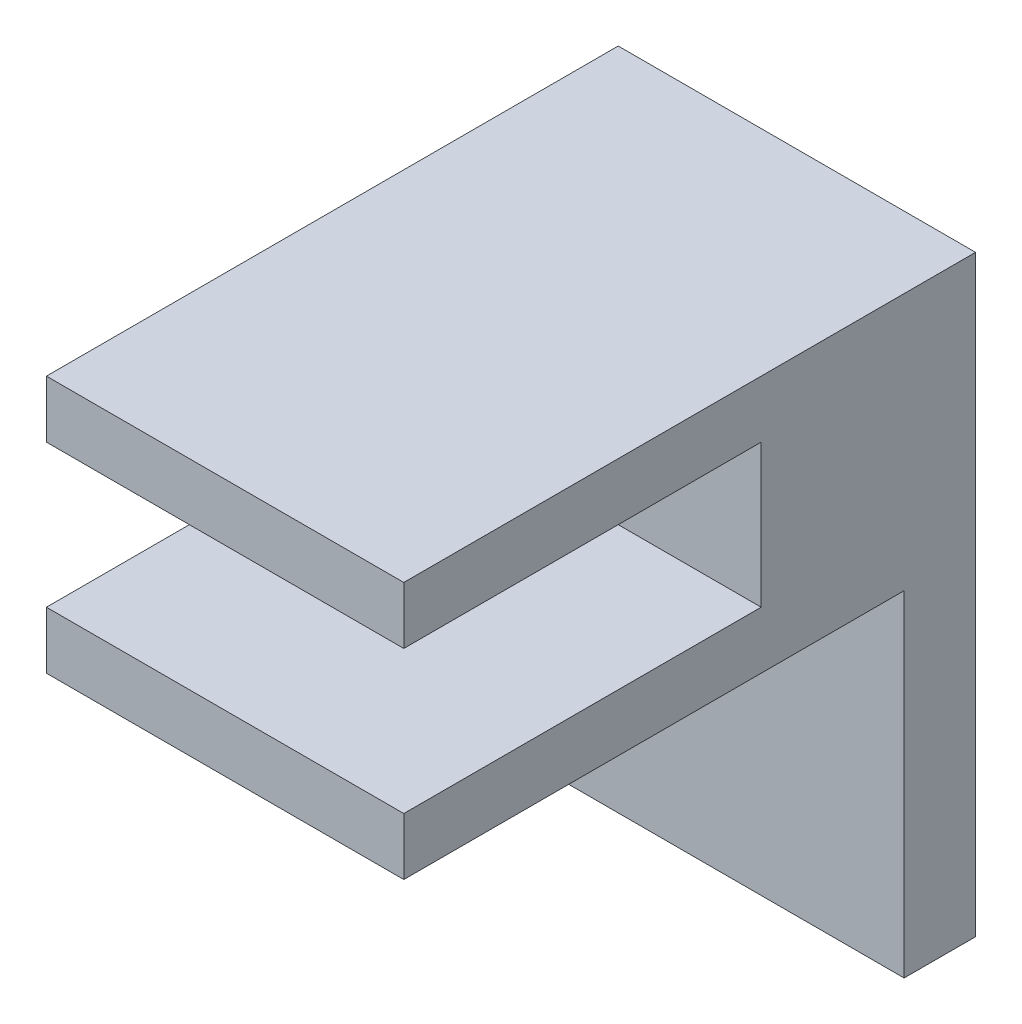
ISO-10303-21;
HEADER;
FILE_DESCRIPTION(('STEP AP214'),'2;1');
FILE_NAME('part.step','',(''),(''),'','','');
FILE_SCHEMA(('AUTOMOTIVE_DESIGN { 1 0 10303 214 1 1 1 1 }'));
ENDSEC;
DATA;
#1=APPLICATION_CONTEXT('core data for automotive mechanical design processes');
#2=APPLICATION_PROTOCOL_DEFINITION('international standard','automotive_design',2000,#1);
#3=PRODUCT_CONTEXT('',#1,'mechanical');
#4=PRODUCT('Part','Part','',(#3));
#5=PRODUCT_RELATED_PRODUCT_CATEGORY('part','',(#4));
#6=PRODUCT_DEFINITION_FORMATION('','',#4);
#7=PRODUCT_DEFINITION_CONTEXT('part definition',#1,'design');
#8=PRODUCT_DEFINITION('design','',#6,#7);
#9=PRODUCT_DEFINITION_SHAPE('','',#8);
#10=(LENGTH_UNIT() NAMED_UNIT(*) SI_UNIT(.MILLI.,.METRE.));
#11=(NAMED_UNIT(*) PLANE_ANGLE_UNIT() SI_UNIT($,.RADIAN.));
#12=(NAMED_UNIT(*) SI_UNIT($,.STERADIAN.) SOLID_ANGLE_UNIT());
#13=UNCERTAINTY_MEASURE_WITH_UNIT(LENGTH_MEASURE(1.E-05),#10,'distance_accuracy_value','');
#14=(GEOMETRIC_REPRESENTATION_CONTEXT(3) GLOBAL_UNCERTAINTY_ASSIGNED_CONTEXT((#13)) GLOBAL_UNIT_ASSIGNED_CONTEXT((#10,
#11,#12)) REPRESENTATION_CONTEXT('',''));
#15=CARTESIAN_POINT('',(0.,0.,0.));
#16=DIRECTION('',(0.,0.,1.));
#17=DIRECTION('',(1.,0.,0.));
#18=AXIS2_PLACEMENT_3D('',#15,#16,#17);
#19=CARTESIAN_POINT('',(12.5,0.,0.));
#20=DIRECTION('',(0.,0.,1.));
#21=DIRECTION('',(1.,0.,0.));
#22=AXIS2_PLACEMENT_3D('',#19,#20,#21);
#23=PLANE('',#22);
#24=DIRECTION('',(0.,1.,0.));
#25=VECTOR('',#24,1.);
#26=CARTESIAN_POINT('',(-12.5,0.,0.));
#27=LINE('',#26,#25);
#28=CARTESIAN_POINT('',(-12.5,-22.6367730720593,0.));
#29=VERTEX_POINT('',#28);
#30=CARTESIAN_POINT('',(-12.5,18.8277402245337,0.));
#31=VERTEX_POINT('',#30);
#32=EDGE_CURVE('E93',#29,#31,#27,.T.);
#33=ORIENTED_EDGE('',*,*,#32,.T.);
#34=DIRECTION('',(-1.,0.,0.));
#35=VECTOR('',#34,1.);
#36=CARTESIAN_POINT('',(12.5,18.8277402245337,0.));
#37=LINE('',#36,#35);
#38=CARTESIAN_POINT('',(12.5,18.8277402245337,0.));
#39=VERTEX_POINT('',#38);
#40=EDGE_CURVE('E11',#39,#31,#37,.T.);
#41=ORIENTED_EDGE('',*,*,#40,.F.);
#42=DIRECTION('',(0.,1.,0.));
#43=VECTOR('',#42,1.);
#44=CARTESIAN_POINT('',(12.5,0.,0.));
#45=LINE('',#44,#43);
#46=CARTESIAN_POINT('',(12.5,-22.6367730720593,0.));
#47=VERTEX_POINT('',#46);
#48=EDGE_CURVE('E99',#47,#39,#45,.T.);
#49=ORIENTED_EDGE('',*,*,#48,.F.);
#50=DIRECTION('',(-1.,0.,0.));
#51=VECTOR('',#50,1.);
#52=CARTESIAN_POINT('',(12.5,-22.6367730720593,0.));
#53=LINE('',#52,#51);
#54=EDGE_CURVE('E139',#47,#29,#53,.T.);
#55=ORIENTED_EDGE('',*,*,#54,.T.);
#56=EDGE_LOOP('',(#33,#41,#49,#55));
#57=FACE_BOUND('',#56,.T.);
#58=ADVANCED_FACE('F35',(#57),#23,.F.);
#59=CARTESIAN_POINT('',(12.5,18.8277402245337,0.));
#60=DIRECTION('',(0.,-1.,0.));
#61=DIRECTION('',(0.,0.,-1.));
#62=AXIS2_PLACEMENT_3D('',#59,#60,#61);
#63=PLANE('',#62);
#64=DIRECTION('',(0.,0.,1.));
#65=VECTOR('',#64,1.);
#66=CARTESIAN_POINT('',(-12.5,18.8277402245337,0.));
#67=LINE('',#66,#65);
#68=CARTESIAN_POINT('',(-12.5,18.8277402245337,40.));
#69=VERTEX_POINT('',#68);
#70=EDGE_CURVE('E144',#31,#69,#67,.T.);
#71=ORIENTED_EDGE('',*,*,#70,.T.);
#72=DIRECTION('',(-1.,0.,0.));
#73=VECTOR('',#72,1.);
#74=CARTESIAN_POINT('',(12.5,18.8277402245337,40.));
#75=LINE('',#74,#73);
#76=CARTESIAN_POINT('',(12.5,18.8277402245337,40.));
#77=VERTEX_POINT('',#76);
#78=EDGE_CURVE('E43',#77,#69,#75,.T.);
#79=ORIENTED_EDGE('',*,*,#78,.F.);
#80=DIRECTION('',(0.,0.,1.));
#81=VECTOR('',#80,1.);
#82=CARTESIAN_POINT('',(12.5,18.8277402245337,0.));
#83=LINE('',#82,#81);
#84=EDGE_CURVE('E206',#39,#77,#83,.T.);
#85=ORIENTED_EDGE('',*,*,#84,.F.);
#86=ORIENTED_EDGE('',*,*,#40,.T.);
#87=EDGE_LOOP('',(#71,#79,#85,#86));
#88=FACE_BOUND('',#87,.T.);
#89=ADVANCED_FACE('F208',(#88),#63,.F.);
#90=CARTESIAN_POINT('',(12.5,14.8277402245337,40.));
#91=DIRECTION('',(0.,0.,-1.));
#92=DIRECTION('',(-1.,0.,0.));
#93=AXIS2_PLACEMENT_3D('',#90,#91,#92);
#94=PLANE('',#93);
#95=DIRECTION('',(0.,-1.,0.));
#96=VECTOR('',#95,1.);
#97=CARTESIAN_POINT('',(-12.5,14.8277402245337,40.));
#98=LINE('',#97,#96);
#99=CARTESIAN_POINT('',(-12.5,14.8277402245337,40.));
#100=VERTEX_POINT('',#99);
#101=EDGE_CURVE('E146',#69,#100,#98,.T.);
#102=ORIENTED_EDGE('',*,*,#101,.T.);
#103=DIRECTION('',(-1.,0.,0.));
#104=VECTOR('',#103,1.);
#105=CARTESIAN_POINT('',(12.5,14.8277402245337,40.));
#106=LINE('',#105,#104);
#107=CARTESIAN_POINT('',(12.5,14.8277402245337,40.));
#108=VERTEX_POINT('',#107);
#109=EDGE_CURVE('E173',#108,#100,#106,.T.);
#110=ORIENTED_EDGE('',*,*,#109,.F.);
#111=DIRECTION('',(0.,-1.,0.));
#112=VECTOR('',#111,1.);
#113=CARTESIAN_POINT('',(12.5,14.8277402245337,40.));
#114=LINE('',#113,#112);
#115=EDGE_CURVE('E182',#77,#108,#114,.T.);
#116=ORIENTED_EDGE('',*,*,#115,.F.);
#117=ORIENTED_EDGE('',*,*,#78,.T.);
#118=EDGE_LOOP('',(#102,#110,#116,#117));
#119=FACE_BOUND('',#118,.T.);
#120=ADVANCED_FACE('F180',(#119),#94,.F.);
#121=CARTESIAN_POINT('',(12.5,14.8277402245337,40.));
#122=DIRECTION('',(0.,1.,0.));
#123=DIRECTION('',(0.,0.,1.));
#124=AXIS2_PLACEMENT_3D('',#121,#122,#123);
#125=PLANE('',#124);
#126=DIRECTION('',(0.,0.,-1.));
#127=VECTOR('',#126,1.);
#128=CARTESIAN_POINT('',(-12.5,14.8277402245337,40.));
#129=LINE('',#128,#127);
#130=CARTESIAN_POINT('',(-12.5,14.8277402245337,15.));
#131=VERTEX_POINT('',#130);
#132=EDGE_CURVE('E148',#100,#131,#129,.T.);
#133=ORIENTED_EDGE('',*,*,#132,.T.);
#134=DIRECTION('',(-1.,0.,0.));
#135=VECTOR('',#134,1.);
#136=CARTESIAN_POINT('',(12.5,14.8277402245337,15.));
#137=LINE('',#136,#135);
#138=CARTESIAN_POINT('',(12.5,14.8277402245337,15.));
#139=VERTEX_POINT('',#138);
#140=EDGE_CURVE('E170',#139,#131,#137,.T.);
#141=ORIENTED_EDGE('',*,*,#140,.F.);
#142=DIRECTION('',(0.,0.,-1.));
#143=VECTOR('',#142,1.);
#144=CARTESIAN_POINT('',(12.5,14.8277402245337,40.));
#145=LINE('',#144,#143);
#146=EDGE_CURVE('E200',#108,#139,#145,.T.);
#147=ORIENTED_EDGE('',*,*,#146,.F.);
#148=ORIENTED_EDGE('',*,*,#109,.T.);
#149=EDGE_LOOP('',(#133,#141,#147,#148));
#150=FACE_BOUND('',#149,.T.);
#151=ADVANCED_FACE('F191',(#150),#125,.F.);
#152=CARTESIAN_POINT('',(12.5,14.8277402245337,15.));
#153=DIRECTION('',(0.,0.,-1.));
#154=DIRECTION('',(0.,1.,0.));
#155=AXIS2_PLACEMENT_3D('',#152,#153,#154);
#156=PLANE('',#155);
#157=DIRECTION('',(0.,-1.,0.));
#158=VECTOR('',#157,1.);
#159=CARTESIAN_POINT('',(-12.5,14.8277402245337,15.));
#160=LINE('',#159,#158);
#161=CARTESIAN_POINT('',(-12.5,4.8277402245337,15.));
#162=VERTEX_POINT('',#161);
#163=EDGE_CURVE('E150',#131,#162,#160,.T.);
#164=ORIENTED_EDGE('',*,*,#163,.T.);
#165=DIRECTION('',(-1.,0.,0.));
#166=VECTOR('',#165,1.);
#167=CARTESIAN_POINT('',(12.5,4.8277402245337,15.));
#168=LINE('',#167,#166);
#169=CARTESIAN_POINT('',(12.5,4.8277402245337,15.));
#170=VERTEX_POINT('',#169);
#171=EDGE_CURVE('E167',#170,#162,#168,.T.);
#172=ORIENTED_EDGE('',*,*,#171,.F.);
#173=DIRECTION('',(0.,-1.,0.));
#174=VECTOR('',#173,1.);
#175=CARTESIAN_POINT('',(12.5,14.8277402245337,15.));
#176=LINE('',#175,#174);
#177=EDGE_CURVE('E197',#139,#170,#176,.T.);
#178=ORIENTED_EDGE('',*,*,#177,.F.);
#179=ORIENTED_EDGE('',*,*,#140,.T.);
#180=EDGE_LOOP('',(#164,#172,#178,#179));
#181=FACE_BOUND('',#180,.T.);
#182=ADVANCED_FACE('F195',(#181),#156,.F.);
#183=CARTESIAN_POINT('',(12.5,4.8277402245337,40.));
#184=DIRECTION('',(0.,-1.,0.));
#185=DIRECTION('',(0.,0.,-1.));
#186=AXIS2_PLACEMENT_3D('',#183,#184,#185);
#187=PLANE('',#186);
#188=DIRECTION('',(0.,0.,1.));
#189=VECTOR('',#188,1.);
#190=CARTESIAN_POINT('',(-12.5,4.8277402245337,40.));
#191=LINE('',#190,#189);
#192=CARTESIAN_POINT('',(-12.5,4.8277402245337,40.));
#193=VERTEX_POINT('',#192);
#194=EDGE_CURVE('E152',#162,#193,#191,.T.);
#195=ORIENTED_EDGE('',*,*,#194,.T.);
#196=DIRECTION('',(-1.,0.,0.));
#197=VECTOR('',#196,1.);
#198=CARTESIAN_POINT('',(12.5,4.8277402245337,40.));
#199=LINE('',#198,#197);
#200=CARTESIAN_POINT('',(12.5,4.8277402245337,40.));
#201=VERTEX_POINT('',#200);
#202=EDGE_CURVE('E164',#201,#193,#199,.T.);
#203=ORIENTED_EDGE('',*,*,#202,.F.);
#204=DIRECTION('',(0.,0.,1.));
#205=VECTOR('',#204,1.);
#206=CARTESIAN_POINT('',(12.5,4.8277402245337,40.));
#207=LINE('',#206,#205);
#208=EDGE_CURVE('E199',#170,#201,#207,.T.);
#209=ORIENTED_EDGE('',*,*,#208,.F.);
#210=ORIENTED_EDGE('',*,*,#171,.T.);
#211=EDGE_LOOP('',(#195,#203,#209,#210));
#212=FACE_BOUND('',#211,.T.);
#213=ADVANCED_FACE('F217',(#212),#187,.F.);
#214=CARTESIAN_POINT('',(12.5,0.827740224533705,40.));
#215=DIRECTION('',(0.,0.,-1.));
#216=DIRECTION('',(-1.,0.,0.));
#217=AXIS2_PLACEMENT_3D('',#214,#215,#216);
#218=PLANE('',#217);
#219=DIRECTION('',(0.,-1.,0.));
#220=VECTOR('',#219,1.);
#221=CARTESIAN_POINT('',(-12.5,0.827740224533705,40.));
#222=LINE('',#221,#220);
#223=CARTESIAN_POINT('',(-12.5,0.827740224533705,40.));
#224=VERTEX_POINT('',#223);
#225=EDGE_CURVE('E154',#193,#224,#222,.T.);
#226=ORIENTED_EDGE('',*,*,#225,.T.);
#227=DIRECTION('',(-1.,0.,0.));
#228=VECTOR('',#227,1.);
#229=CARTESIAN_POINT('',(12.5,0.827740224533705,40.));
#230=LINE('',#229,#228);
#231=CARTESIAN_POINT('',(12.5,0.827740224533705,40.));
#232=VERTEX_POINT('',#231);
#233=EDGE_CURVE('E134',#232,#224,#230,.T.);
#234=ORIENTED_EDGE('',*,*,#233,.F.);
#235=DIRECTION('',(0.,-1.,0.));
#236=VECTOR('',#235,1.);
#237=CARTESIAN_POINT('',(12.5,0.827740224533705,40.));
#238=LINE('',#237,#236);
#239=EDGE_CURVE('E125',#201,#232,#238,.T.);
#240=ORIENTED_EDGE('',*,*,#239,.F.);
#241=ORIENTED_EDGE('',*,*,#202,.T.);
#242=EDGE_LOOP('',(#226,#234,#240,#241));
#243=FACE_BOUND('',#242,.T.);
#244=ADVANCED_FACE('F214',(#243),#218,.F.);
#245=CARTESIAN_POINT('',(12.5,0.827740224533709,5.));
#246=DIRECTION('',(0.,1.,0.));
#247=DIRECTION('',(0.,0.,1.));
#248=AXIS2_PLACEMENT_3D('',#245,#246,#247);
#249=PLANE('',#248);
#250=DIRECTION('',(0.,0.,-1.));
#251=VECTOR('',#250,1.);
#252=CARTESIAN_POINT('',(-12.5,0.827740224533709,5.));
#253=LINE('',#252,#251);
#254=CARTESIAN_POINT('',(-12.5,0.827740224533709,5.));
#255=VERTEX_POINT('',#254);
#256=EDGE_CURVE('E133',#224,#255,#253,.T.);
#257=ORIENTED_EDGE('',*,*,#256,.T.);
#258=DIRECTION('',(-1.,0.,0.));
#259=VECTOR('',#258,1.);
#260=CARTESIAN_POINT('',(12.5,0.827740224533709,5.));
#261=LINE('',#260,#259);
#262=CARTESIAN_POINT('',(12.5,0.827740224533709,5.));
#263=VERTEX_POINT('',#262);
#264=EDGE_CURVE('E130',#263,#255,#261,.T.);
#265=ORIENTED_EDGE('',*,*,#264,.F.);
#266=DIRECTION('',(0.,0.,-1.));
#267=VECTOR('',#266,1.);
#268=CARTESIAN_POINT('',(12.5,0.827740224533709,5.));
#269=LINE('',#268,#267);
#270=EDGE_CURVE('E119',#232,#263,#269,.T.);
#271=ORIENTED_EDGE('',*,*,#270,.F.);
#272=ORIENTED_EDGE('',*,*,#233,.T.);
#273=EDGE_LOOP('',(#257,#265,#271,#272));
#274=FACE_BOUND('',#273,.T.);
#275=ADVANCED_FACE('F131',(#274),#249,.F.);
#276=CARTESIAN_POINT('',(12.5,0.827740224533709,5.));
#277=DIRECTION('',(0.,0.,-1.));
#278=DIRECTION('',(0.,1.,0.));
#279=AXIS2_PLACEMENT_3D('',#276,#277,#278);
#280=PLANE('',#279);
#281=DIRECTION('',(0.,-1.,0.));
#282=VECTOR('',#281,1.);
#283=CARTESIAN_POINT('',(-12.5,0.827740224533709,5.));
#284=LINE('',#283,#282);
#285=CARTESIAN_POINT('',(-12.5,-22.6367730720593,5.));
#286=VERTEX_POINT('',#285);
#287=EDGE_CURVE('E86',#255,#286,#284,.T.);
#288=ORIENTED_EDGE('',*,*,#287,.T.);
#289=DIRECTION('',(-1.,0.,0.));
#290=VECTOR('',#289,1.);
#291=CARTESIAN_POINT('',(12.5,-22.6367730720593,5.));
#292=LINE('',#291,#290);
#293=CARTESIAN_POINT('',(12.5,-22.6367730720593,5.));
#294=VERTEX_POINT('',#293);
#295=EDGE_CURVE('E135',#294,#286,#292,.T.);
#296=ORIENTED_EDGE('',*,*,#295,.F.);
#297=DIRECTION('',(0.,-1.,0.));
#298=VECTOR('',#297,1.);
#299=CARTESIAN_POINT('',(12.5,0.827740224533709,5.));
#300=LINE('',#299,#298);
#301=EDGE_CURVE('E123',#263,#294,#300,.T.);
#302=ORIENTED_EDGE('',*,*,#301,.F.);
#303=ORIENTED_EDGE('',*,*,#264,.T.);
#304=EDGE_LOOP('',(#288,#296,#302,#303));
#305=FACE_BOUND('',#304,.T.);
#306=ADVANCED_FACE('F137',(#305),#280,.F.);
#307=CARTESIAN_POINT('',(12.5,-22.6367730720593,5.));
#308=DIRECTION('',(0.,1.,0.));
#309=DIRECTION('',(0.,0.,1.));
#310=AXIS2_PLACEMENT_3D('',#307,#308,#309);
#311=PLANE('',#310);
#312=DIRECTION('',(0.,0.,-1.));
#313=VECTOR('',#312,1.);
#314=CARTESIAN_POINT('',(-12.5,-22.6367730720593,5.));
#315=LINE('',#314,#313);
#316=EDGE_CURVE('E158',#286,#29,#315,.T.);
#317=ORIENTED_EDGE('',*,*,#316,.T.);
#318=ORIENTED_EDGE('',*,*,#54,.F.);
#319=DIRECTION('',(0.,0.,-1.));
#320=VECTOR('',#319,1.);
#321=CARTESIAN_POINT('',(12.5,-22.6367730720593,5.));
#322=LINE('',#321,#320);
#323=EDGE_CURVE('E51',#294,#47,#322,.T.);
#324=ORIENTED_EDGE('',*,*,#323,.F.);
#325=ORIENTED_EDGE('',*,*,#295,.T.);
#326=EDGE_LOOP('',(#317,#318,#324,#325));
#327=FACE_BOUND('',#326,.T.);
#328=ADVANCED_FACE('F211',(#327),#311,.F.);
#329=CARTESIAN_POINT('',(12.5,0.,0.));
#330=DIRECTION('',(1.,0.,0.));
#331=DIRECTION('',(0.,0.,-1.));
#332=AXIS2_PLACEMENT_3D('',#329,#330,#331);
#333=PLANE('',#332);
#334=ORIENTED_EDGE('',*,*,#48,.T.);
#335=ORIENTED_EDGE('',*,*,#84,.T.);
#336=ORIENTED_EDGE('',*,*,#115,.T.);
#337=ORIENTED_EDGE('',*,*,#146,.T.);
#338=ORIENTED_EDGE('',*,*,#177,.T.);
#339=ORIENTED_EDGE('',*,*,#208,.T.);
#340=ORIENTED_EDGE('',*,*,#239,.T.);
#341=ORIENTED_EDGE('',*,*,#270,.T.);
#342=ORIENTED_EDGE('',*,*,#301,.T.);
#343=ORIENTED_EDGE('',*,*,#323,.T.);
#344=EDGE_LOOP('',(#334,#335,#336,#337,#338,#339,#340,#341,#342,#343));
#345=FACE_BOUND('',#344,.T.);
#346=ADVANCED_FACE('F121',(#345),#333,.T.);
#347=CARTESIAN_POINT('',(-12.5,0.,0.));
#348=DIRECTION('',(1.,0.,0.));
#349=DIRECTION('',(0.,0.,-1.));
#350=AXIS2_PLACEMENT_3D('',#347,#348,#349);
#351=PLANE('',#350);
#352=ORIENTED_EDGE('',*,*,#32,.F.);
#353=ORIENTED_EDGE('',*,*,#316,.F.);
#354=ORIENTED_EDGE('',*,*,#287,.F.);
#355=ORIENTED_EDGE('',*,*,#256,.F.);
#356=ORIENTED_EDGE('',*,*,#225,.F.);
#357=ORIENTED_EDGE('',*,*,#194,.F.);
#358=ORIENTED_EDGE('',*,*,#163,.F.);
#359=ORIENTED_EDGE('',*,*,#132,.F.);
#360=ORIENTED_EDGE('',*,*,#101,.F.);
#361=ORIENTED_EDGE('',*,*,#70,.F.);
#362=EDGE_LOOP('',(#352,#353,#354,#355,#356,#357,#358,#359,#360,#361));
#363=FACE_BOUND('',#362,.T.);
#364=ADVANCED_FACE('F186',(#363),#351,.F.);
#365=CLOSED_SHELL('',(#58,#89,#120,#151,#182,#213,#244,#275,#306,#328,#346,#364));
#366=MANIFOLD_SOLID_BREP('B2',#365);
#367=ADVANCED_BREP_SHAPE_REPRESENTATION('',(#18,#366),#14);
#368=SHAPE_DEFINITION_REPRESENTATION(#9,#367);
ENDSEC;
END-ISO-10303-21;
